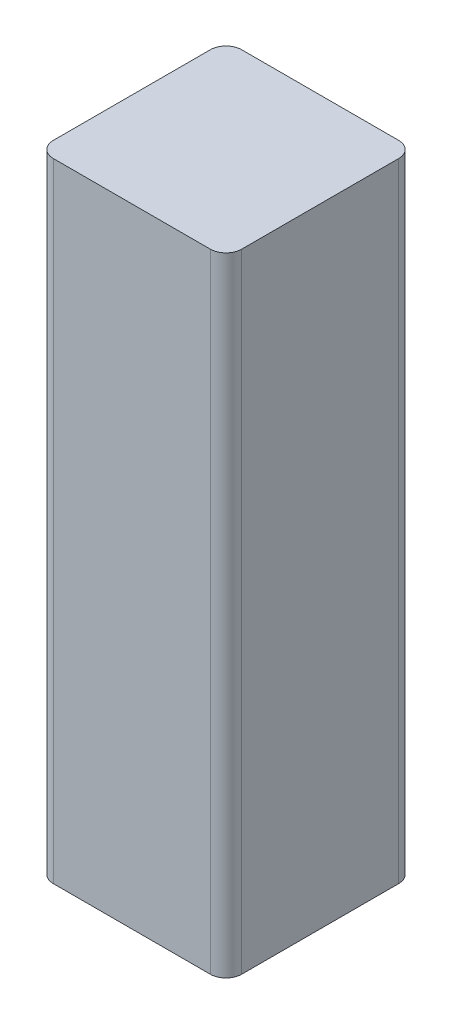
ISO-10303-21;
HEADER;
FILE_DESCRIPTION(('STEP AP214'),'2;1');
FILE_NAME('part.step','',(''),(''),'','','');
FILE_SCHEMA(('AUTOMOTIVE_DESIGN { 1 0 10303 214 1 1 1 1 }'));
ENDSEC;
DATA;
#1=APPLICATION_CONTEXT('core data for automotive mechanical design processes');
#2=APPLICATION_PROTOCOL_DEFINITION('international standard','automotive_design',2000,#1);
#3=PRODUCT_CONTEXT('',#1,'mechanical');
#4=PRODUCT('Part','Part','',(#3));
#5=PRODUCT_RELATED_PRODUCT_CATEGORY('part','',(#4));
#6=PRODUCT_DEFINITION_FORMATION('','',#4);
#7=PRODUCT_DEFINITION_CONTEXT('part definition',#1,'design');
#8=PRODUCT_DEFINITION('design','',#6,#7);
#9=PRODUCT_DEFINITION_SHAPE('','',#8);
#10=(LENGTH_UNIT() NAMED_UNIT(*) SI_UNIT(.MILLI.,.METRE.));
#11=(NAMED_UNIT(*) PLANE_ANGLE_UNIT() SI_UNIT($,.RADIAN.));
#12=(NAMED_UNIT(*) SI_UNIT($,.STERADIAN.) SOLID_ANGLE_UNIT());
#13=UNCERTAINTY_MEASURE_WITH_UNIT(LENGTH_MEASURE(1.E-05),#10,'distance_accuracy_value','');
#14=(GEOMETRIC_REPRESENTATION_CONTEXT(3) GLOBAL_UNCERTAINTY_ASSIGNED_CONTEXT((#13)) GLOBAL_UNIT_ASSIGNED_CONTEXT((#10,
#11,#12)) REPRESENTATION_CONTEXT('',''));
#15=CARTESIAN_POINT('',(0.,0.,0.));
#16=DIRECTION('',(0.,0.,1.));
#17=DIRECTION('',(1.,0.,0.));
#18=AXIS2_PLACEMENT_3D('',#15,#16,#17);
#19=CARTESIAN_POINT('',(2.50000000000002,20.,2.50000000000003));
#20=DIRECTION('',(0.,-1.,0.));
#21=DIRECTION('',(0.,0.,-1.));
#22=AXIS2_PLACEMENT_3D('',#19,#20,#21);
#23=CYLINDRICAL_SURFACE('',#22,0.5);
#24=CARTESIAN_POINT('',(2.50000000000002,0.,2.50000000000003));
#25=DIRECTION('',(0.,1.,0.));
#26=DIRECTION('',(0.,0.,1.));
#27=AXIS2_PLACEMENT_3D('',#24,#25,#26);
#28=CIRCLE('',#27,0.5);
#29=CARTESIAN_POINT('',(2.50000000000002,0.,3.00000000000003));
#30=VERTEX_POINT('',#29);
#31=CARTESIAN_POINT('',(3.00000000000003,0.,2.50000000000003));
#32=VERTEX_POINT('',#31);
#33=EDGE_CURVE('E140',#30,#32,#28,.T.);
#34=ORIENTED_EDGE('',*,*,#33,.T.);
#35=DIRECTION('',(0.,-1.,0.));
#36=VECTOR('',#35,1.);
#37=CARTESIAN_POINT('',(3.00000000000003,20.,2.50000000000003));
#38=LINE('',#37,#36);
#39=CARTESIAN_POINT('',(3.00000000000003,20.,2.50000000000003));
#40=VERTEX_POINT('',#39);
#41=EDGE_CURVE('E11',#40,#32,#38,.T.);
#42=ORIENTED_EDGE('',*,*,#41,.F.);
#43=CARTESIAN_POINT('',(2.50000000000002,20.,2.50000000000003));
#44=DIRECTION('',(0.,1.,0.));
#45=DIRECTION('',(0.,0.,1.));
#46=AXIS2_PLACEMENT_3D('',#43,#44,#45);
#47=CIRCLE('',#46,0.5);
#48=CARTESIAN_POINT('',(2.50000000000002,20.,3.00000000000003));
#49=VERTEX_POINT('',#48);
#50=EDGE_CURVE('E162',#49,#40,#47,.T.);
#51=ORIENTED_EDGE('',*,*,#50,.F.);
#52=DIRECTION('',(0.,-1.,0.));
#53=VECTOR('',#52,1.);
#54=CARTESIAN_POINT('',(2.50000000000002,20.,3.00000000000003));
#55=LINE('',#54,#53);
#56=EDGE_CURVE('E136',#49,#30,#55,.T.);
#57=ORIENTED_EDGE('',*,*,#56,.T.);
#58=EDGE_LOOP('',(#34,#42,#51,#57));
#59=FACE_BOUND('',#58,.T.);
#60=ADVANCED_FACE('F39',(#59),#23,.T.);
#61=CARTESIAN_POINT('',(3.00000000000003,20.,2.50000000000003));
#62=DIRECTION('',(-1.,0.,0.));
#63=DIRECTION('',(0.,0.,1.));
#64=AXIS2_PLACEMENT_3D('',#61,#62,#63);
#65=PLANE('',#64);
#66=DIRECTION('',(0.,0.,-1.));
#67=VECTOR('',#66,1.);
#68=CARTESIAN_POINT('',(3.00000000000003,0.,2.50000000000003));
#69=LINE('',#68,#67);
#70=CARTESIAN_POINT('',(3.00000000000003,0.,-2.49999999999997));
#71=VERTEX_POINT('',#70);
#72=EDGE_CURVE('E144',#32,#71,#69,.T.);
#73=ORIENTED_EDGE('',*,*,#72,.T.);
#74=DIRECTION('',(0.,-1.,0.));
#75=VECTOR('',#74,1.);
#76=CARTESIAN_POINT('',(3.00000000000003,20.,-2.49999999999997));
#77=LINE('',#76,#75);
#78=CARTESIAN_POINT('',(3.00000000000003,20.,-2.49999999999997));
#79=VERTEX_POINT('',#78);
#80=EDGE_CURVE('E48',#79,#71,#77,.T.);
#81=ORIENTED_EDGE('',*,*,#80,.F.);
#82=DIRECTION('',(0.,0.,-1.));
#83=VECTOR('',#82,1.);
#84=CARTESIAN_POINT('',(3.00000000000003,20.,2.50000000000003));
#85=LINE('',#84,#83);
#86=EDGE_CURVE('E99',#40,#79,#85,.T.);
#87=ORIENTED_EDGE('',*,*,#86,.F.);
#88=ORIENTED_EDGE('',*,*,#41,.T.);
#89=EDGE_LOOP('',(#73,#81,#87,#88));
#90=FACE_BOUND('',#89,.T.);
#91=ADVANCED_FACE('F208',(#90),#65,.F.);
#92=CARTESIAN_POINT('',(2.50000000000002,20.,-2.49999999999997));
#93=DIRECTION('',(0.,-1.,0.));
#94=DIRECTION('',(0.,0.,-1.));
#95=AXIS2_PLACEMENT_3D('',#92,#93,#94);
#96=CYLINDRICAL_SURFACE('',#95,0.5);
#97=CARTESIAN_POINT('',(2.50000000000002,0.,-2.49999999999997));
#98=DIRECTION('',(0.,1.,0.));
#99=DIRECTION('',(0.,0.,1.));
#100=AXIS2_PLACEMENT_3D('',#97,#98,#99);
#101=CIRCLE('',#100,0.5);
#102=CARTESIAN_POINT('',(2.50000000000002,0.,-2.99999999999998));
#103=VERTEX_POINT('',#102);
#104=EDGE_CURVE('E147',#71,#103,#101,.T.);
#105=ORIENTED_EDGE('',*,*,#104,.T.);
#106=DIRECTION('',(0.,-1.,0.));
#107=VECTOR('',#106,1.);
#108=CARTESIAN_POINT('',(2.50000000000002,20.,-2.99999999999998));
#109=LINE('',#108,#107);
#110=CARTESIAN_POINT('',(2.50000000000002,20.,-2.99999999999998));
#111=VERTEX_POINT('',#110);
#112=EDGE_CURVE('E173',#111,#103,#109,.T.);
#113=ORIENTED_EDGE('',*,*,#112,.F.);
#114=CARTESIAN_POINT('',(2.50000000000002,20.,-2.49999999999997));
#115=DIRECTION('',(0.,1.,0.));
#116=DIRECTION('',(0.,0.,1.));
#117=AXIS2_PLACEMENT_3D('',#114,#115,#116);
#118=CIRCLE('',#117,0.5);
#119=EDGE_CURVE('E183',#79,#111,#118,.T.);
#120=ORIENTED_EDGE('',*,*,#119,.F.);
#121=ORIENTED_EDGE('',*,*,#80,.T.);
#122=EDGE_LOOP('',(#105,#113,#120,#121));
#123=FACE_BOUND('',#122,.T.);
#124=ADVANCED_FACE('F181',(#123),#96,.T.);
#125=CARTESIAN_POINT('',(-2.49999999999997,20.,-2.99999999999998));
#126=DIRECTION('',(0.,0.,1.));
#127=DIRECTION('',(1.,0.,0.));
#128=AXIS2_PLACEMENT_3D('',#125,#126,#127);
#129=PLANE('',#128);
#130=DIRECTION('',(-1.,0.,0.));
#131=VECTOR('',#130,1.);
#132=CARTESIAN_POINT('',(-2.49999999999997,0.,-2.99999999999998));
#133=LINE('',#132,#131);
#134=CARTESIAN_POINT('',(-2.49999999999997,0.,-2.99999999999997));
#135=VERTEX_POINT('',#134);
#136=EDGE_CURVE('E150',#103,#135,#133,.T.);
#137=ORIENTED_EDGE('',*,*,#136,.T.);
#138=DIRECTION('',(0.,-1.,0.));
#139=VECTOR('',#138,1.);
#140=CARTESIAN_POINT('',(-2.49999999999997,20.,-2.99999999999997));
#141=LINE('',#140,#139);
#142=CARTESIAN_POINT('',(-2.49999999999997,20.,-2.99999999999997));
#143=VERTEX_POINT('',#142);
#144=EDGE_CURVE('E169',#143,#135,#141,.T.);
#145=ORIENTED_EDGE('',*,*,#144,.F.);
#146=DIRECTION('',(-1.,0.,0.));
#147=VECTOR('',#146,1.);
#148=CARTESIAN_POINT('',(-2.49999999999997,20.,-2.99999999999998));
#149=LINE('',#148,#147);
#150=EDGE_CURVE('E196',#111,#143,#149,.T.);
#151=ORIENTED_EDGE('',*,*,#150,.F.);
#152=ORIENTED_EDGE('',*,*,#112,.T.);
#153=EDGE_LOOP('',(#137,#145,#151,#152));
#154=FACE_BOUND('',#153,.T.);
#155=ADVANCED_FACE('F191',(#154),#129,.F.);
#156=CARTESIAN_POINT('',(-2.49999999999997,20.,-2.49999999999997));
#157=DIRECTION('',(0.,-1.,0.));
#158=DIRECTION('',(0.,0.,-1.));
#159=AXIS2_PLACEMENT_3D('',#156,#157,#158);
#160=CYLINDRICAL_SURFACE('',#159,0.5);
#161=CARTESIAN_POINT('',(-2.49999999999997,0.,-2.49999999999997));
#162=DIRECTION('',(0.,1.,0.));
#163=DIRECTION('',(0.,0.,1.));
#164=AXIS2_PLACEMENT_3D('',#161,#162,#163);
#165=CIRCLE('',#164,0.5);
#166=CARTESIAN_POINT('',(-2.99999999999997,0.,-2.49999999999997));
#167=VERTEX_POINT('',#166);
#168=EDGE_CURVE('E153',#135,#167,#165,.T.);
#169=ORIENTED_EDGE('',*,*,#168,.T.);
#170=DIRECTION('',(0.,-1.,0.));
#171=VECTOR('',#170,1.);
#172=CARTESIAN_POINT('',(-2.99999999999997,20.,-2.49999999999997));
#173=LINE('',#172,#171);
#174=CARTESIAN_POINT('',(-2.99999999999997,20.,-2.49999999999997));
#175=VERTEX_POINT('',#174);
#176=EDGE_CURVE('E129',#175,#167,#173,.T.);
#177=ORIENTED_EDGE('',*,*,#176,.F.);
#178=CARTESIAN_POINT('',(-2.49999999999997,20.,-2.49999999999997));
#179=DIRECTION('',(0.,1.,0.));
#180=DIRECTION('',(0.,0.,1.));
#181=AXIS2_PLACEMENT_3D('',#178,#179,#180);
#182=CIRCLE('',#181,0.5);
#183=EDGE_CURVE('E118',#143,#175,#182,.T.);
#184=ORIENTED_EDGE('',*,*,#183,.F.);
#185=ORIENTED_EDGE('',*,*,#144,.T.);
#186=EDGE_LOOP('',(#169,#177,#184,#185));
#187=FACE_BOUND('',#186,.T.);
#188=ADVANCED_FACE('F194',(#187),#160,.T.);
#189=CARTESIAN_POINT('',(-2.99999999999997,20.,2.50000000000003));
#190=DIRECTION('',(1.,0.,0.));
#191=DIRECTION('',(0.,0.,-1.));
#192=AXIS2_PLACEMENT_3D('',#189,#190,#191);
#193=PLANE('',#192);
#194=DIRECTION('',(0.,0.,1.));
#195=VECTOR('',#194,1.);
#196=CARTESIAN_POINT('',(-2.99999999999997,0.,2.50000000000003));
#197=LINE('',#196,#195);
#198=CARTESIAN_POINT('',(-2.99999999999998,0.,2.50000000000003));
#199=VERTEX_POINT('',#198);
#200=EDGE_CURVE('E127',#167,#199,#197,.T.);
#201=ORIENTED_EDGE('',*,*,#200,.T.);
#202=DIRECTION('',(0.,-1.,0.));
#203=VECTOR('',#202,1.);
#204=CARTESIAN_POINT('',(-2.99999999999998,20.,2.50000000000003));
#205=LINE('',#204,#203);
#206=CARTESIAN_POINT('',(-2.99999999999998,20.,2.50000000000003));
#207=VERTEX_POINT('',#206);
#208=EDGE_CURVE('E124',#207,#199,#205,.T.);
#209=ORIENTED_EDGE('',*,*,#208,.F.);
#210=DIRECTION('',(0.,0.,1.));
#211=VECTOR('',#210,1.);
#212=CARTESIAN_POINT('',(-2.99999999999997,20.,2.50000000000003));
#213=LINE('',#212,#211);
#214=EDGE_CURVE('E112',#175,#207,#213,.T.);
#215=ORIENTED_EDGE('',*,*,#214,.F.);
#216=ORIENTED_EDGE('',*,*,#176,.T.);
#217=EDGE_LOOP('',(#201,#209,#215,#216));
#218=FACE_BOUND('',#217,.T.);
#219=ADVANCED_FACE('F125',(#218),#193,.F.);
#220=CARTESIAN_POINT('',(-2.49999999999997,20.,2.50000000000003));
#221=DIRECTION('',(0.,-1.,0.));
#222=DIRECTION('',(0.,0.,-1.));
#223=AXIS2_PLACEMENT_3D('',#220,#221,#222);
#224=CYLINDRICAL_SURFACE('',#223,0.5);
#225=CARTESIAN_POINT('',(-2.49999999999997,0.,2.50000000000003));
#226=DIRECTION('',(0.,1.,0.));
#227=DIRECTION('',(0.,0.,-1.));
#228=AXIS2_PLACEMENT_3D('',#225,#226,#227);
#229=CIRCLE('',#228,0.5);
#230=CARTESIAN_POINT('',(-2.49999999999997,0.,3.00000000000003));
#231=VERTEX_POINT('',#230);
#232=EDGE_CURVE('E85',#199,#231,#229,.T.);
#233=ORIENTED_EDGE('',*,*,#232,.T.);
#234=DIRECTION('',(0.,-1.,0.));
#235=VECTOR('',#234,1.);
#236=CARTESIAN_POINT('',(-2.49999999999997,20.,3.00000000000003));
#237=LINE('',#236,#235);
#238=CARTESIAN_POINT('',(-2.49999999999997,20.,3.00000000000003));
#239=VERTEX_POINT('',#238);
#240=EDGE_CURVE('E130',#239,#231,#237,.T.);
#241=ORIENTED_EDGE('',*,*,#240,.F.);
#242=CARTESIAN_POINT('',(-2.49999999999997,20.,2.50000000000003));
#243=DIRECTION('',(0.,1.,0.));
#244=DIRECTION('',(0.,0.,-1.));
#245=AXIS2_PLACEMENT_3D('',#242,#243,#244);
#246=CIRCLE('',#245,0.5);
#247=EDGE_CURVE('E116',#207,#239,#246,.T.);
#248=ORIENTED_EDGE('',*,*,#247,.F.);
#249=ORIENTED_EDGE('',*,*,#208,.T.);
#250=EDGE_LOOP('',(#233,#241,#248,#249));
#251=FACE_BOUND('',#250,.T.);
#252=ADVANCED_FACE('F132',(#251),#224,.T.);
#253=CARTESIAN_POINT('',(-2.49999999999997,20.,3.00000000000003));
#254=DIRECTION('',(0.,0.,-1.));
#255=DIRECTION('',(-1.,0.,0.));
#256=AXIS2_PLACEMENT_3D('',#253,#254,#255);
#257=PLANE('',#256);
#258=DIRECTION('',(1.,0.,0.));
#259=VECTOR('',#258,1.);
#260=CARTESIAN_POINT('',(-2.49999999999997,0.,3.00000000000003));
#261=LINE('',#260,#259);
#262=EDGE_CURVE('E91',#231,#30,#261,.T.);
#263=ORIENTED_EDGE('',*,*,#262,.T.);
#264=ORIENTED_EDGE('',*,*,#56,.F.);
#265=DIRECTION('',(1.,0.,0.));
#266=VECTOR('',#265,1.);
#267=CARTESIAN_POINT('',(-2.49999999999997,20.,3.00000000000003));
#268=LINE('',#267,#266);
#269=EDGE_CURVE('E56',#239,#49,#268,.T.);
#270=ORIENTED_EDGE('',*,*,#269,.F.);
#271=ORIENTED_EDGE('',*,*,#240,.T.);
#272=EDGE_LOOP('',(#263,#264,#270,#271));
#273=FACE_BOUND('',#272,.T.);
#274=ADVANCED_FACE('F224',(#273),#257,.F.);
#275=CARTESIAN_POINT('',(2.50000000000002,20.,2.50000000000003));
#276=DIRECTION('',(0.,1.,0.));
#277=DIRECTION('',(0.,0.,1.));
#278=AXIS2_PLACEMENT_3D('',#275,#276,#277);
#279=PLANE('',#278);
#280=ORIENTED_EDGE('',*,*,#50,.T.);
#281=ORIENTED_EDGE('',*,*,#86,.T.);
#282=ORIENTED_EDGE('',*,*,#119,.T.);
#283=ORIENTED_EDGE('',*,*,#150,.T.);
#284=ORIENTED_EDGE('',*,*,#183,.T.);
#285=ORIENTED_EDGE('',*,*,#214,.T.);
#286=ORIENTED_EDGE('',*,*,#247,.T.);
#287=ORIENTED_EDGE('',*,*,#269,.T.);
#288=EDGE_LOOP('',(#280,#281,#282,#283,#284,#285,#286,#287));
#289=FACE_BOUND('',#288,.T.);
#290=ADVANCED_FACE('F114',(#289),#279,.T.);
#291=CARTESIAN_POINT('',(2.50000000000002,0.,2.50000000000003));
#292=DIRECTION('',(0.,1.,0.));
#293=DIRECTION('',(0.,0.,1.));
#294=AXIS2_PLACEMENT_3D('',#291,#292,#293);
#295=PLANE('',#294);
#296=ORIENTED_EDGE('',*,*,#33,.F.);
#297=ORIENTED_EDGE('',*,*,#262,.F.);
#298=ORIENTED_EDGE('',*,*,#232,.F.);
#299=ORIENTED_EDGE('',*,*,#200,.F.);
#300=ORIENTED_EDGE('',*,*,#168,.F.);
#301=ORIENTED_EDGE('',*,*,#136,.F.);
#302=ORIENTED_EDGE('',*,*,#104,.F.);
#303=ORIENTED_EDGE('',*,*,#72,.F.);
#304=EDGE_LOOP('',(#296,#297,#298,#299,#300,#301,#302,#303));
#305=FACE_BOUND('',#304,.T.);
#306=ADVANCED_FACE('F187',(#305),#295,.F.);
#307=CLOSED_SHELL('',(#60,#91,#124,#155,#188,#219,#252,#274,#290,#306));
#308=MANIFOLD_SOLID_BREP('B2',#307);
#309=ADVANCED_BREP_SHAPE_REPRESENTATION('',(#18,#308),#14);
#310=SHAPE_DEFINITION_REPRESENTATION(#9,#309);
ENDSEC;
END-ISO-10303-21;
